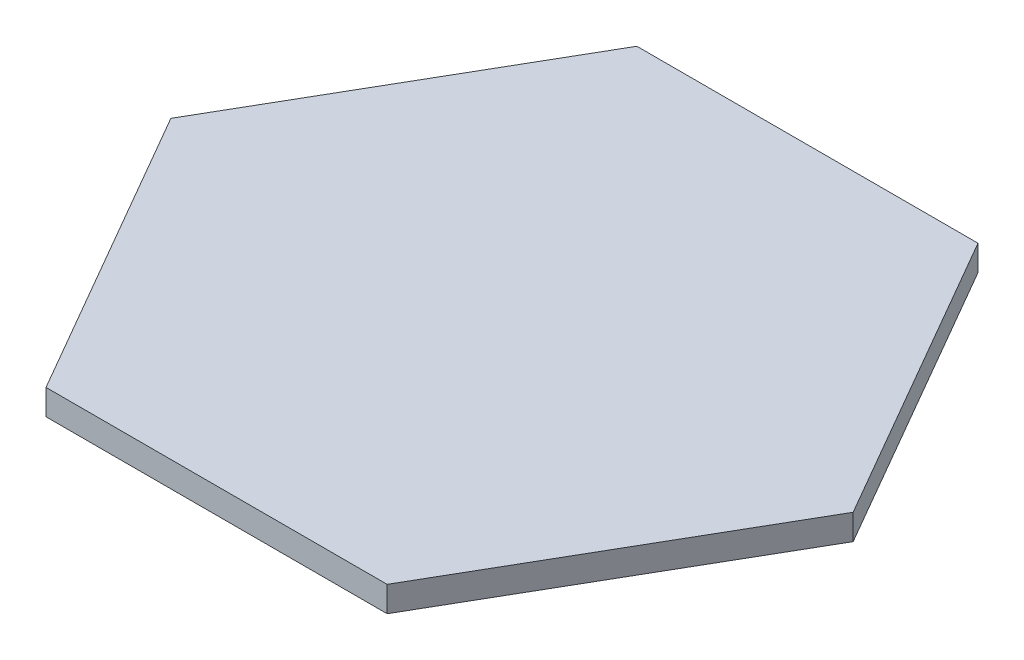
ISO-10303-21;
HEADER;
FILE_DESCRIPTION(('STEP AP214'),'2;1');
FILE_NAME('part.step','',(''),(''),'','','');
FILE_SCHEMA(('AUTOMOTIVE_DESIGN { 1 0 10303 214 1 1 1 1 }'));
ENDSEC;
DATA;
#1=APPLICATION_CONTEXT('core data for automotive mechanical design processes');
#2=APPLICATION_PROTOCOL_DEFINITION('international standard','automotive_design',2000,#1);
#3=PRODUCT_CONTEXT('',#1,'mechanical');
#4=PRODUCT('Part','Part','',(#3));
#5=PRODUCT_RELATED_PRODUCT_CATEGORY('part','',(#4));
#6=PRODUCT_DEFINITION_FORMATION('','',#4);
#7=PRODUCT_DEFINITION_CONTEXT('part definition',#1,'design');
#8=PRODUCT_DEFINITION('design','',#6,#7);
#9=PRODUCT_DEFINITION_SHAPE('','',#8);
#10=(LENGTH_UNIT() NAMED_UNIT(*) SI_UNIT(.MILLI.,.METRE.));
#11=(NAMED_UNIT(*) PLANE_ANGLE_UNIT() SI_UNIT($,.RADIAN.));
#12=(NAMED_UNIT(*) SI_UNIT($,.STERADIAN.) SOLID_ANGLE_UNIT());
#13=UNCERTAINTY_MEASURE_WITH_UNIT(LENGTH_MEASURE(1.E-05),#10,'distance_accuracy_value','');
#14=(GEOMETRIC_REPRESENTATION_CONTEXT(3) GLOBAL_UNCERTAINTY_ASSIGNED_CONTEXT((#13)) GLOBAL_UNIT_ASSIGNED_CONTEXT((#10,
#11,#12)) REPRESENTATION_CONTEXT('',''));
#15=CARTESIAN_POINT('',(0.,0.,0.));
#16=DIRECTION('',(0.,0.,1.));
#17=DIRECTION('',(1.,0.,0.));
#18=AXIS2_PLACEMENT_3D('',#15,#16,#17);
#19=CARTESIAN_POINT('',(-85.0525588832576,6.35,0.));
#20=DIRECTION('',(0.866025403784439,0.,-0.5));
#21=DIRECTION('',(-0.5,0.,-0.866025403784439));
#22=AXIS2_PLACEMENT_3D('',#19,#20,#21);
#23=PLANE('',#22);
#24=DIRECTION('',(0.5,0.,0.866025403784439));
#25=VECTOR('',#24,1.);
#26=CARTESIAN_POINT('',(-85.0525588832576,0.,0.));
#27=LINE('',#26,#25);
#28=CARTESIAN_POINT('',(-85.0525588832576,0.,0.));
#29=VERTEX_POINT('',#28);
#30=CARTESIAN_POINT('',(-42.5262794416288,0.,73.6576766497729));
#31=VERTEX_POINT('',#30);
#32=EDGE_CURVE('E125',#29,#31,#27,.T.);
#33=ORIENTED_EDGE('',*,*,#32,.T.);
#34=DIRECTION('',(0.,-1.,0.));
#35=VECTOR('',#34,1.);
#36=CARTESIAN_POINT('',(-42.5262794416288,6.35,73.6576766497729));
#37=LINE('',#36,#35);
#38=CARTESIAN_POINT('',(-42.5262794416288,6.35,73.6576766497729));
#39=VERTEX_POINT('',#38);
#40=EDGE_CURVE('E11',#39,#31,#37,.T.);
#41=ORIENTED_EDGE('',*,*,#40,.F.);
#42=DIRECTION('',(0.5,0.,0.866025403784439));
#43=VECTOR('',#42,1.);
#44=CARTESIAN_POINT('',(-85.0525588832576,6.35,0.));
#45=LINE('',#44,#43);
#46=CARTESIAN_POINT('',(-85.0525588832576,6.35,0.));
#47=VERTEX_POINT('',#46);
#48=EDGE_CURVE('E135',#47,#39,#45,.T.);
#49=ORIENTED_EDGE('',*,*,#48,.F.);
#50=DIRECTION('',(0.,-1.,0.));
#51=VECTOR('',#50,1.);
#52=CARTESIAN_POINT('',(-85.0525588832576,6.35,0.));
#53=LINE('',#52,#51);
#54=EDGE_CURVE('E121',#47,#29,#53,.T.);
#55=ORIENTED_EDGE('',*,*,#54,.T.);
#56=EDGE_LOOP('',(#33,#41,#49,#55));
#57=FACE_BOUND('',#56,.T.);
#58=ADVANCED_FACE('F41',(#57),#23,.F.);
#59=CARTESIAN_POINT('',(-42.5262794416288,6.35,73.6576766497729));
#60=DIRECTION('',(0.,0.,-1.));
#61=DIRECTION('',(-1.,0.,0.));
#62=AXIS2_PLACEMENT_3D('',#59,#60,#61);
#63=PLANE('',#62);
#64=DIRECTION('',(1.,0.,0.));
#65=VECTOR('',#64,1.);
#66=CARTESIAN_POINT('',(-42.5262794416288,0.,73.6576766497729));
#67=LINE('',#66,#65);
#68=CARTESIAN_POINT('',(42.5262794416288,0.,73.6576766497729));
#69=VERTEX_POINT('',#68);
#70=EDGE_CURVE('E128',#31,#69,#67,.T.);
#71=ORIENTED_EDGE('',*,*,#70,.T.);
#72=DIRECTION('',(0.,-1.,0.));
#73=VECTOR('',#72,1.);
#74=CARTESIAN_POINT('',(42.5262794416288,6.35,73.6576766497729));
#75=LINE('',#74,#73);
#76=CARTESIAN_POINT('',(42.5262794416288,6.35,73.6576766497729));
#77=VERTEX_POINT('',#76);
#78=EDGE_CURVE('E49',#77,#69,#75,.T.);
#79=ORIENTED_EDGE('',*,*,#78,.F.);
#80=DIRECTION('',(1.,0.,0.));
#81=VECTOR('',#80,1.);
#82=CARTESIAN_POINT('',(-42.5262794416288,6.35,73.6576766497729));
#83=LINE('',#82,#81);
#84=EDGE_CURVE('E94',#39,#77,#83,.T.);
#85=ORIENTED_EDGE('',*,*,#84,.F.);
#86=ORIENTED_EDGE('',*,*,#40,.T.);
#87=EDGE_LOOP('',(#71,#79,#85,#86));
#88=FACE_BOUND('',#87,.T.);
#89=ADVANCED_FACE('F159',(#88),#63,.F.);
#90=CARTESIAN_POINT('',(42.5262794416288,6.35,73.6576766497729));
#91=DIRECTION('',(-0.866025403784439,0.,-0.5));
#92=DIRECTION('',(-0.5,0.,0.866025403784439));
#93=AXIS2_PLACEMENT_3D('',#90,#91,#92);
#94=PLANE('',#93);
#95=DIRECTION('',(0.5,0.,-0.866025403784439));
#96=VECTOR('',#95,1.);
#97=CARTESIAN_POINT('',(42.5262794416288,0.,73.6576766497729));
#98=LINE('',#97,#96);
#99=CARTESIAN_POINT('',(85.0525588832576,0.,0.));
#100=VERTEX_POINT('',#99);
#101=EDGE_CURVE('E130',#69,#100,#98,.T.);
#102=ORIENTED_EDGE('',*,*,#101,.T.);
#103=DIRECTION('',(0.,-1.,0.));
#104=VECTOR('',#103,1.);
#105=CARTESIAN_POINT('',(85.0525588832576,6.35,0.));
#106=LINE('',#105,#104);
#107=CARTESIAN_POINT('',(85.0525588832576,6.35,0.));
#108=VERTEX_POINT('',#107);
#109=EDGE_CURVE('E116',#108,#100,#106,.T.);
#110=ORIENTED_EDGE('',*,*,#109,.F.);
#111=DIRECTION('',(0.5,0.,-0.866025403784439));
#112=VECTOR('',#111,1.);
#113=CARTESIAN_POINT('',(42.5262794416288,6.35,73.6576766497729));
#114=LINE('',#113,#112);
#115=EDGE_CURVE('E107',#77,#108,#114,.T.);
#116=ORIENTED_EDGE('',*,*,#115,.F.);
#117=ORIENTED_EDGE('',*,*,#78,.T.);
#118=EDGE_LOOP('',(#102,#110,#116,#117));
#119=FACE_BOUND('',#118,.T.);
#120=ADVANCED_FACE('F141',(#119),#94,.F.);
#121=CARTESIAN_POINT('',(85.0525588832576,6.35,0.));
#122=DIRECTION('',(-0.866025403784439,0.,0.5));
#123=DIRECTION('',(0.5,0.,0.866025403784439));
#124=AXIS2_PLACEMENT_3D('',#121,#122,#123);
#125=PLANE('',#124);
#126=DIRECTION('',(-0.5,0.,-0.866025403784439));
#127=VECTOR('',#126,1.);
#128=CARTESIAN_POINT('',(85.0525588832576,0.,0.));
#129=LINE('',#128,#127);
#130=CARTESIAN_POINT('',(42.5262794416288,0.,-73.6576766497729));
#131=VERTEX_POINT('',#130);
#132=EDGE_CURVE('E115',#100,#131,#129,.T.);
#133=ORIENTED_EDGE('',*,*,#132,.T.);
#134=DIRECTION('',(0.,-1.,0.));
#135=VECTOR('',#134,1.);
#136=CARTESIAN_POINT('',(42.5262794416288,6.35,-73.6576766497729));
#137=LINE('',#136,#135);
#138=CARTESIAN_POINT('',(42.5262794416288,6.35,-73.6576766497729));
#139=VERTEX_POINT('',#138);
#140=EDGE_CURVE('E112',#139,#131,#137,.T.);
#141=ORIENTED_EDGE('',*,*,#140,.F.);
#142=DIRECTION('',(-0.5,0.,-0.866025403784439));
#143=VECTOR('',#142,1.);
#144=CARTESIAN_POINT('',(85.0525588832576,6.35,0.));
#145=LINE('',#144,#143);
#146=EDGE_CURVE('E101',#108,#139,#145,.T.);
#147=ORIENTED_EDGE('',*,*,#146,.F.);
#148=ORIENTED_EDGE('',*,*,#109,.T.);
#149=EDGE_LOOP('',(#133,#141,#147,#148));
#150=FACE_BOUND('',#149,.T.);
#151=ADVANCED_FACE('F113',(#150),#125,.F.);
#152=CARTESIAN_POINT('',(42.5262794416288,6.35,-73.6576766497729));
#153=DIRECTION('',(0.,0.,1.));
#154=DIRECTION('',(1.,0.,0.));
#155=AXIS2_PLACEMENT_3D('',#152,#153,#154);
#156=PLANE('',#155);
#157=DIRECTION('',(-1.,0.,0.));
#158=VECTOR('',#157,1.);
#159=CARTESIAN_POINT('',(42.5262794416288,0.,-73.6576766497729));
#160=LINE('',#159,#158);
#161=CARTESIAN_POINT('',(-42.5262794416288,0.,-73.6576766497729));
#162=VERTEX_POINT('',#161);
#163=EDGE_CURVE('E80',#131,#162,#160,.T.);
#164=ORIENTED_EDGE('',*,*,#163,.T.);
#165=DIRECTION('',(0.,-1.,0.));
#166=VECTOR('',#165,1.);
#167=CARTESIAN_POINT('',(-42.5262794416288,6.35,-73.6576766497729));
#168=LINE('',#167,#166);
#169=CARTESIAN_POINT('',(-42.5262794416288,6.35,-73.6576766497729));
#170=VERTEX_POINT('',#169);
#171=EDGE_CURVE('E117',#170,#162,#168,.T.);
#172=ORIENTED_EDGE('',*,*,#171,.F.);
#173=DIRECTION('',(-1.,0.,0.));
#174=VECTOR('',#173,1.);
#175=CARTESIAN_POINT('',(42.5262794416288,6.35,-73.6576766497729));
#176=LINE('',#175,#174);
#177=EDGE_CURVE('E105',#139,#170,#176,.T.);
#178=ORIENTED_EDGE('',*,*,#177,.F.);
#179=ORIENTED_EDGE('',*,*,#140,.T.);
#180=EDGE_LOOP('',(#164,#172,#178,#179));
#181=FACE_BOUND('',#180,.T.);
#182=ADVANCED_FACE('F119',(#181),#156,.F.);
#183=CARTESIAN_POINT('',(-42.5262794416288,6.35,-73.6576766497729));
#184=DIRECTION('',(0.866025403784439,0.,0.5));
#185=DIRECTION('',(0.5,0.,-0.866025403784439));
#186=AXIS2_PLACEMENT_3D('',#183,#184,#185);
#187=PLANE('',#186);
#188=DIRECTION('',(-0.5,0.,0.866025403784439));
#189=VECTOR('',#188,1.);
#190=CARTESIAN_POINT('',(-42.5262794416288,0.,-73.6576766497729));
#191=LINE('',#190,#189);
#192=EDGE_CURVE('E86',#162,#29,#191,.T.);
#193=ORIENTED_EDGE('',*,*,#192,.T.);
#194=ORIENTED_EDGE('',*,*,#54,.F.);
#195=DIRECTION('',(-0.5,0.,0.866025403784439));
#196=VECTOR('',#195,1.);
#197=CARTESIAN_POINT('',(-42.5262794416288,6.35,-73.6576766497729));
#198=LINE('',#197,#196);
#199=EDGE_CURVE('E57',#170,#47,#198,.T.);
#200=ORIENTED_EDGE('',*,*,#199,.F.);
#201=ORIENTED_EDGE('',*,*,#171,.T.);
#202=EDGE_LOOP('',(#193,#194,#200,#201));
#203=FACE_BOUND('',#202,.T.);
#204=ADVANCED_FACE('F148',(#203),#187,.F.);
#205=CARTESIAN_POINT('',(0.,6.35,0.));
#206=DIRECTION('',(0.,1.,0.));
#207=DIRECTION('',(0.,0.,1.));
#208=AXIS2_PLACEMENT_3D('',#205,#206,#207);
#209=PLANE('',#208);
#210=ORIENTED_EDGE('',*,*,#48,.T.);
#211=ORIENTED_EDGE('',*,*,#84,.T.);
#212=ORIENTED_EDGE('',*,*,#115,.T.);
#213=ORIENTED_EDGE('',*,*,#146,.T.);
#214=ORIENTED_EDGE('',*,*,#177,.T.);
#215=ORIENTED_EDGE('',*,*,#199,.T.);
#216=EDGE_LOOP('',(#210,#211,#212,#213,#214,#215));
#217=FACE_BOUND('',#216,.T.);
#218=ADVANCED_FACE('F103',(#217),#209,.T.);
#219=CARTESIAN_POINT('',(0.,0.,0.));
#220=DIRECTION('',(0.,1.,0.));
#221=DIRECTION('',(0.,0.,1.));
#222=AXIS2_PLACEMENT_3D('',#219,#220,#221);
#223=PLANE('',#222);
#224=ORIENTED_EDGE('',*,*,#32,.F.);
#225=ORIENTED_EDGE('',*,*,#192,.F.);
#226=ORIENTED_EDGE('',*,*,#163,.F.);
#227=ORIENTED_EDGE('',*,*,#132,.F.);
#228=ORIENTED_EDGE('',*,*,#101,.F.);
#229=ORIENTED_EDGE('',*,*,#70,.F.);
#230=EDGE_LOOP('',(#224,#225,#226,#227,#228,#229));
#231=FACE_BOUND('',#230,.T.);
#232=ADVANCED_FACE('F144',(#231),#223,.F.);
#233=CLOSED_SHELL('',(#58,#89,#120,#151,#182,#204,#218,#232));
#234=MANIFOLD_SOLID_BREP('B2',#233);
#235=ADVANCED_BREP_SHAPE_REPRESENTATION('',(#18,#234),#14);
#236=SHAPE_DEFINITION_REPRESENTATION(#9,#235);
ENDSEC;
END-ISO-10303-21;
